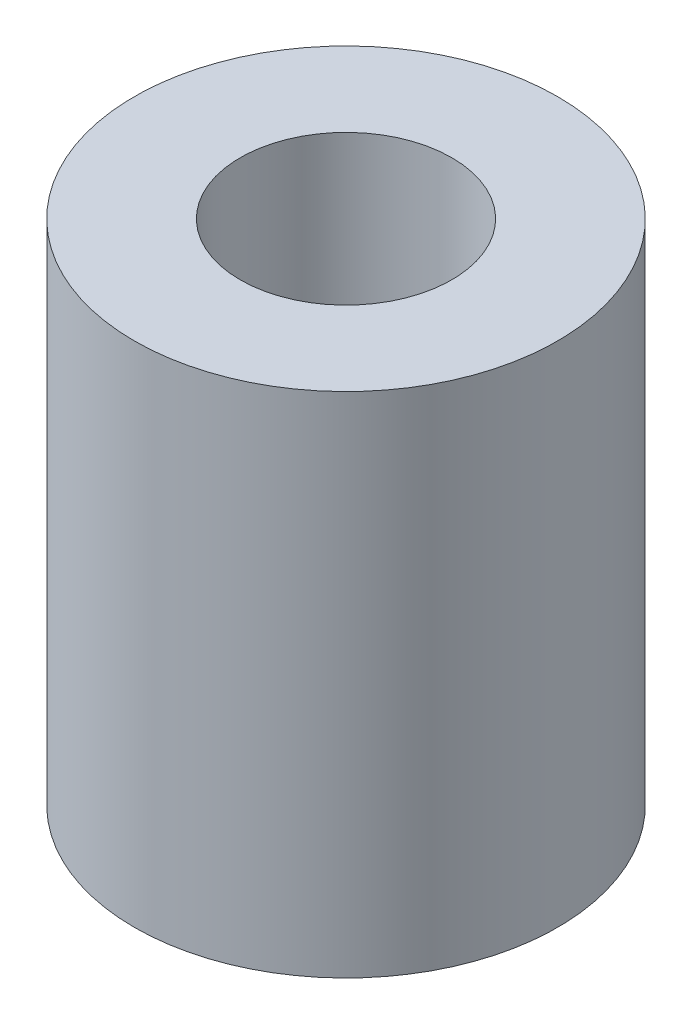
ISO-10303-21;
HEADER;
FILE_DESCRIPTION(('STEP AP214'),'2;1');
FILE_NAME('part.step','',(''),(''),'','','');
FILE_SCHEMA(('AUTOMOTIVE_DESIGN { 1 0 10303 214 1 1 1 1 }'));
ENDSEC;
DATA;
#1=APPLICATION_CONTEXT('core data for automotive mechanical design processes');
#2=APPLICATION_PROTOCOL_DEFINITION('international standard','automotive_design',2000,#1);
#3=PRODUCT_CONTEXT('',#1,'mechanical');
#4=PRODUCT('Part','Part','',(#3));
#5=PRODUCT_RELATED_PRODUCT_CATEGORY('part','',(#4));
#6=PRODUCT_DEFINITION_FORMATION('','',#4);
#7=PRODUCT_DEFINITION_CONTEXT('part definition',#1,'design');
#8=PRODUCT_DEFINITION('design','',#6,#7);
#9=PRODUCT_DEFINITION_SHAPE('','',#8);
#10=(LENGTH_UNIT() NAMED_UNIT(*) SI_UNIT(.MILLI.,.METRE.));
#11=(NAMED_UNIT(*) PLANE_ANGLE_UNIT() SI_UNIT($,.RADIAN.));
#12=(NAMED_UNIT(*) SI_UNIT($,.STERADIAN.) SOLID_ANGLE_UNIT());
#13=UNCERTAINTY_MEASURE_WITH_UNIT(LENGTH_MEASURE(1.E-05),#10,'distance_accuracy_value','');
#14=(GEOMETRIC_REPRESENTATION_CONTEXT(3) GLOBAL_UNCERTAINTY_ASSIGNED_CONTEXT((#13)) GLOBAL_UNIT_ASSIGNED_CONTEXT((#10,
#11,#12)) REPRESENTATION_CONTEXT('',''));
#15=CARTESIAN_POINT('',(0.,0.,0.));
#16=DIRECTION('',(0.,0.,1.));
#17=DIRECTION('',(1.,0.,0.));
#18=AXIS2_PLACEMENT_3D('',#15,#16,#17);
#19=CARTESIAN_POINT('',(0.,6.,0.));
#20=DIRECTION('',(0.,-1.,0.));
#21=DIRECTION('',(0.,0.,-1.));
#22=AXIS2_PLACEMENT_3D('',#19,#20,#21);
#23=CYLINDRICAL_SURFACE('',#22,2.5);
#24=CARTESIAN_POINT('',(0.,6.,0.));
#25=DIRECTION('',(0.,1.,0.));
#26=DIRECTION('',(0.,0.,1.));
#27=AXIS2_PLACEMENT_3D('',#24,#25,#26);
#28=CIRCLE('',#27,2.5);
#29=CARTESIAN_POINT('',(0.,6.,2.5));
#30=VERTEX_POINT('',#29);
#31=EDGE_CURVE('E10',#30,#30,#28,.T.);
#32=ORIENTED_EDGE('',*,*,#31,.F.);
#33=EDGE_LOOP('',(#32));
#34=FACE_BOUND('',#33,.T.);
#35=CARTESIAN_POINT('',(0.,0.,0.));
#36=DIRECTION('',(0.,1.,0.));
#37=DIRECTION('',(0.,0.,1.));
#38=AXIS2_PLACEMENT_3D('',#35,#36,#37);
#39=CIRCLE('',#38,2.5);
#40=CARTESIAN_POINT('',(0.,0.,2.5));
#41=VERTEX_POINT('',#40);
#42=EDGE_CURVE('E39',#41,#41,#39,.T.);
#43=ORIENTED_EDGE('',*,*,#42,.T.);
#44=EDGE_LOOP('',(#43));
#45=FACE_BOUND('',#44,.T.);
#46=ADVANCED_FACE('F36',(#34,#45),#23,.T.);
#47=CARTESIAN_POINT('',(0.,6.,0.));
#48=DIRECTION('',(0.,1.,0.));
#49=DIRECTION('',(0.,0.,1.));
#50=AXIS2_PLACEMENT_3D('',#47,#48,#49);
#51=PLANE('',#50);
#52=CARTESIAN_POINT('',(0.,6.,0.));
#53=DIRECTION('',(0.,1.,0.));
#54=DIRECTION('',(0.,0.,1.));
#55=AXIS2_PLACEMENT_3D('',#52,#53,#54);
#56=CIRCLE('',#55,1.24999999999999);
#57=CARTESIAN_POINT('',(0.,6.,1.24999999999999));
#58=VERTEX_POINT('',#57);
#59=EDGE_CURVE('E50',#58,#58,#56,.T.);
#60=ORIENTED_EDGE('',*,*,#59,.F.);
#61=EDGE_LOOP('',(#60));
#62=FACE_BOUND('',#61,.T.);
#63=ORIENTED_EDGE('',*,*,#31,.T.);
#64=EDGE_LOOP('',(#63));
#65=FACE_BOUND('',#64,.T.);
#66=ADVANCED_FACE('F56',(#62,#65),#51,.T.);
#67=CARTESIAN_POINT('',(0.,0.,0.));
#68=DIRECTION('',(0.,1.,0.));
#69=DIRECTION('',(0.,0.,1.));
#70=AXIS2_PLACEMENT_3D('',#67,#68,#69);
#71=PLANE('',#70);
#72=CARTESIAN_POINT('',(0.,0.,0.));
#73=DIRECTION('',(0.,1.,0.));
#74=DIRECTION('',(0.,0.,1.));
#75=AXIS2_PLACEMENT_3D('',#72,#73,#74);
#76=CIRCLE('',#75,1.25);
#77=CARTESIAN_POINT('',(0.,0.,1.25));
#78=VERTEX_POINT('',#77);
#79=EDGE_CURVE('E46',#78,#78,#76,.T.);
#80=ORIENTED_EDGE('',*,*,#79,.T.);
#81=EDGE_LOOP('',(#80));
#82=FACE_BOUND('',#81,.T.);
#83=ORIENTED_EDGE('',*,*,#42,.F.);
#84=EDGE_LOOP('',(#83));
#85=FACE_BOUND('',#84,.T.);
#86=ADVANCED_FACE('F58',(#82,#85),#71,.F.);
#87=CARTESIAN_POINT('',(0.,6.,0.));
#88=DIRECTION('',(0.,1.,0.));
#89=DIRECTION('',(0.,0.,1.));
#90=AXIS2_PLACEMENT_3D('',#87,#88,#89);
#91=CYLINDRICAL_SURFACE('',#90,1.24999999999999);
#92=ORIENTED_EDGE('',*,*,#79,.F.);
#93=EDGE_LOOP('',(#92));
#94=FACE_BOUND('',#93,.T.);
#95=ORIENTED_EDGE('',*,*,#59,.T.);
#96=EDGE_LOOP('',(#95));
#97=FACE_BOUND('',#96,.T.);
#98=ADVANCED_FACE('F54',(#94,#97),#91,.F.);
#99=CLOSED_SHELL('',(#46,#66,#86,#98));
#100=MANIFOLD_SOLID_BREP('B2',#99);
#101=ADVANCED_BREP_SHAPE_REPRESENTATION('',(#18,#100),#14);
#102=SHAPE_DEFINITION_REPRESENTATION(#9,#101);
ENDSEC;
END-ISO-10303-21;
